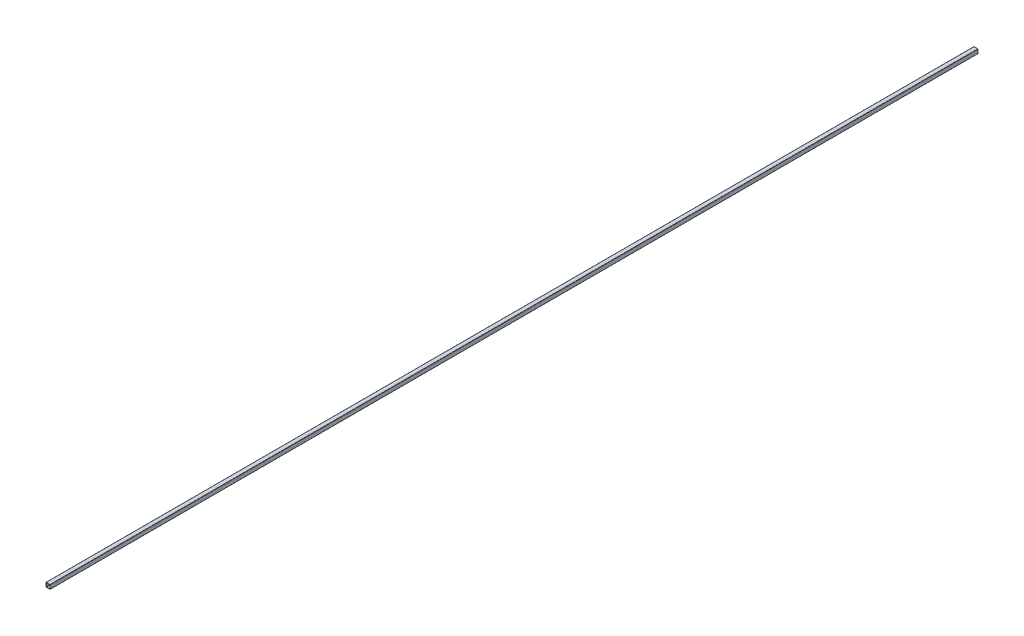
ISO-10303-21;
HEADER;
FILE_DESCRIPTION(('STEP AP214'),'2;1');
FILE_NAME('part.step','',(''),(''),'','','');
FILE_SCHEMA(('AUTOMOTIVE_DESIGN { 1 0 10303 214 1 1 1 1 }'));
ENDSEC;
DATA;
#1=APPLICATION_CONTEXT('core data for automotive mechanical design processes');
#2=APPLICATION_PROTOCOL_DEFINITION('international standard','automotive_design',2000,#1);
#3=PRODUCT_CONTEXT('',#1,'mechanical');
#4=PRODUCT('Part','Part','',(#3));
#5=PRODUCT_RELATED_PRODUCT_CATEGORY('part','',(#4));
#6=PRODUCT_DEFINITION_FORMATION('','',#4);
#7=PRODUCT_DEFINITION_CONTEXT('part definition',#1,'design');
#8=PRODUCT_DEFINITION('design','',#6,#7);
#9=PRODUCT_DEFINITION_SHAPE('','',#8);
#10=(LENGTH_UNIT() NAMED_UNIT(*) SI_UNIT(.MILLI.,.METRE.));
#11=(NAMED_UNIT(*) PLANE_ANGLE_UNIT() SI_UNIT($,.RADIAN.));
#12=(NAMED_UNIT(*) SI_UNIT($,.STERADIAN.) SOLID_ANGLE_UNIT());
#13=UNCERTAINTY_MEASURE_WITH_UNIT(LENGTH_MEASURE(1.E-05),#10,'distance_accuracy_value','');
#14=(GEOMETRIC_REPRESENTATION_CONTEXT(3) GLOBAL_UNCERTAINTY_ASSIGNED_CONTEXT((#13)) GLOBAL_UNIT_ASSIGNED_CONTEXT((#10,
#11,#12)) REPRESENTATION_CONTEXT('',''));
#15=CARTESIAN_POINT('',(0.,0.,0.));
#16=DIRECTION('',(0.,0.,1.));
#17=DIRECTION('',(1.,0.,0.));
#18=AXIS2_PLACEMENT_3D('',#15,#16,#17);
#19=CARTESIAN_POINT('',(2.54,-35.56,8380.));
#20=DIRECTION('',(0.,0.,1.));
#21=DIRECTION('',(1.,0.,0.));
#22=AXIS2_PLACEMENT_3D('',#19,#20,#21);
#23=PLANE('',#22);
#24=CARTESIAN_POINT('',(2.54,-35.56,8380.));
#25=DIRECTION('',(0.,0.,1.));
#26=DIRECTION('',(1.,0.,0.));
#27=AXIS2_PLACEMENT_3D('',#24,#25,#26);
#28=CIRCLE('',#27,2.54);
#29=CARTESIAN_POINT('',(0.,-35.56,8380.));
#30=VERTEX_POINT('',#29);
#31=CARTESIAN_POINT('',(2.54000000000002,-38.1,8380.));
#32=VERTEX_POINT('',#31);
#33=EDGE_CURVE('E211',#30,#32,#28,.T.);
#34=ORIENTED_EDGE('',*,*,#33,.T.);
#35=DIRECTION('',(1.,0.,0.));
#36=VECTOR('',#35,1.);
#37=CARTESIAN_POINT('',(2.54000000000002,-38.1,8380.));
#38=LINE('',#37,#36);
#39=CARTESIAN_POINT('',(35.56,-38.1,8380.));
#40=VERTEX_POINT('',#39);
#41=EDGE_CURVE('E214',#32,#40,#38,.T.);
#42=ORIENTED_EDGE('',*,*,#41,.T.);
#43=CARTESIAN_POINT('',(35.56,-35.56,8380.));
#44=DIRECTION('',(0.,0.,1.));
#45=DIRECTION('',(-1.,0.,0.));
#46=AXIS2_PLACEMENT_3D('',#43,#44,#45);
#47=CIRCLE('',#46,2.54);
#48=CARTESIAN_POINT('',(38.1,-35.56,8380.));
#49=VERTEX_POINT('',#48);
#50=EDGE_CURVE('E217',#40,#49,#47,.T.);
#51=ORIENTED_EDGE('',*,*,#50,.T.);
#52=DIRECTION('',(0.,1.,0.));
#53=VECTOR('',#52,1.);
#54=CARTESIAN_POINT('',(38.1,-2.54000000000002,8380.));
#55=LINE('',#54,#53);
#56=CARTESIAN_POINT('',(38.1,-2.54000000000002,8380.));
#57=VERTEX_POINT('',#56);
#58=EDGE_CURVE('E219',#49,#57,#55,.T.);
#59=ORIENTED_EDGE('',*,*,#58,.T.);
#60=CARTESIAN_POINT('',(35.56,-2.54,8380.));
#61=DIRECTION('',(0.,0.,1.));
#62=DIRECTION('',(1.,0.,0.));
#63=AXIS2_PLACEMENT_3D('',#60,#61,#62);
#64=CIRCLE('',#63,2.54);
#65=CARTESIAN_POINT('',(35.56,0.,8380.));
#66=VERTEX_POINT('',#65);
#67=EDGE_CURVE('E221',#57,#66,#64,.T.);
#68=ORIENTED_EDGE('',*,*,#67,.T.);
#69=DIRECTION('',(-1.,0.,0.));
#70=VECTOR('',#69,1.);
#71=CARTESIAN_POINT('',(2.54000000000002,0.,8380.));
#72=LINE('',#71,#70);
#73=CARTESIAN_POINT('',(2.54000000000002,0.,8380.));
#74=VERTEX_POINT('',#73);
#75=EDGE_CURVE('E223',#66,#74,#72,.T.);
#76=ORIENTED_EDGE('',*,*,#75,.T.);
#77=CARTESIAN_POINT('',(2.54,-2.54,8380.));
#78=DIRECTION('',(0.,0.,1.));
#79=DIRECTION('',(-1.,0.,0.));
#80=AXIS2_PLACEMENT_3D('',#77,#78,#79);
#81=CIRCLE('',#80,2.54);
#82=CARTESIAN_POINT('',(0.,-2.54000000000002,8380.));
#83=VERTEX_POINT('',#82);
#84=EDGE_CURVE('E225',#74,#83,#81,.T.);
#85=ORIENTED_EDGE('',*,*,#84,.T.);
#86=DIRECTION('',(0.,-1.,0.));
#87=VECTOR('',#86,1.);
#88=CARTESIAN_POINT('',(0.,-2.54000000000002,8380.));
#89=LINE('',#88,#87);
#90=EDGE_CURVE('E227',#83,#30,#89,.T.);
#91=ORIENTED_EDGE('',*,*,#90,.T.);
#92=EDGE_LOOP('',(#34,#42,#51,#59,#68,#76,#85,#91));
#93=FACE_BOUND('',#92,.T.);
#94=DIRECTION('',(1.,0.,0.));
#95=VECTOR('',#94,1.);
#96=CARTESIAN_POINT('',(5.30860000000002,-35.3314,8380.));
#97=LINE('',#96,#95);
#98=CARTESIAN_POINT('',(5.30860000000002,-35.3314,8380.));
#99=VERTEX_POINT('',#98);
#100=CARTESIAN_POINT('',(32.7914,-35.3314,8380.));
#101=VERTEX_POINT('',#100);
#102=EDGE_CURVE('E154',#99,#101,#97,.T.);
#103=ORIENTED_EDGE('',*,*,#102,.F.);
#104=CARTESIAN_POINT('',(5.3086,-32.7914,8380.));
#105=DIRECTION('',(0.,0.,1.));
#106=DIRECTION('',(1.,0.,0.));
#107=AXIS2_PLACEMENT_3D('',#104,#105,#106);
#108=CIRCLE('',#107,2.54);
#109=CARTESIAN_POINT('',(2.7686,-32.7914,8380.));
#110=VERTEX_POINT('',#109);
#111=EDGE_CURVE('E146',#110,#99,#108,.T.);
#112=ORIENTED_EDGE('',*,*,#111,.F.);
#113=DIRECTION('',(0.,-1.,0.));
#114=VECTOR('',#113,1.);
#115=CARTESIAN_POINT('',(2.7686,-5.30860000000002,8380.));
#116=LINE('',#115,#114);
#117=CARTESIAN_POINT('',(2.7686,-5.30860000000002,8380.));
#118=VERTEX_POINT('',#117);
#119=EDGE_CURVE('E179',#118,#110,#116,.T.);
#120=ORIENTED_EDGE('',*,*,#119,.F.);
#121=CARTESIAN_POINT('',(5.3086,-5.3086,8380.));
#122=DIRECTION('',(0.,0.,1.));
#123=DIRECTION('',(1.,0.,0.));
#124=AXIS2_PLACEMENT_3D('',#121,#122,#123);
#125=CIRCLE('',#124,2.54);
#126=CARTESIAN_POINT('',(5.30860000000002,-2.7686,8380.));
#127=VERTEX_POINT('',#126);
#128=EDGE_CURVE('E177',#127,#118,#125,.T.);
#129=ORIENTED_EDGE('',*,*,#128,.F.);
#130=DIRECTION('',(-1.,0.,0.));
#131=VECTOR('',#130,1.);
#132=CARTESIAN_POINT('',(5.30860000000002,-2.7686,8380.));
#133=LINE('',#132,#131);
#134=CARTESIAN_POINT('',(32.7914,-2.7686,8380.));
#135=VERTEX_POINT('',#134);
#136=EDGE_CURVE('E175',#135,#127,#133,.T.);
#137=ORIENTED_EDGE('',*,*,#136,.F.);
#138=CARTESIAN_POINT('',(32.7914,-5.3086,8380.));
#139=DIRECTION('',(0.,0.,1.));
#140=DIRECTION('',(1.,0.,0.));
#141=AXIS2_PLACEMENT_3D('',#138,#139,#140);
#142=CIRCLE('',#141,2.54);
#143=CARTESIAN_POINT('',(35.3314,-5.30860000000002,8380.));
#144=VERTEX_POINT('',#143);
#145=EDGE_CURVE('E173',#144,#135,#142,.T.);
#146=ORIENTED_EDGE('',*,*,#145,.F.);
#147=DIRECTION('',(0.,1.,0.));
#148=VECTOR('',#147,1.);
#149=CARTESIAN_POINT('',(35.3314,-5.30860000000002,8380.));
#150=LINE('',#149,#148);
#151=CARTESIAN_POINT('',(35.3314,-32.7914,8380.));
#152=VERTEX_POINT('',#151);
#153=EDGE_CURVE('E169',#152,#144,#150,.T.);
#154=ORIENTED_EDGE('',*,*,#153,.F.);
#155=CARTESIAN_POINT('',(32.7914,-32.7914,8380.));
#156=DIRECTION('',(0.,0.,1.));
#157=DIRECTION('',(1.,0.,0.));
#158=AXIS2_PLACEMENT_3D('',#155,#156,#157);
#159=CIRCLE('',#158,2.54);
#160=EDGE_CURVE('E167',#101,#152,#159,.T.);
#161=ORIENTED_EDGE('',*,*,#160,.F.);
#162=EDGE_LOOP('',(#103,#112,#120,#129,#137,#146,#154,#161));
#163=FACE_BOUND('',#162,.T.);
#164=ADVANCED_FACE('F33',(#93,#163),#23,.T.);
#165=CARTESIAN_POINT('',(2.54,-35.56,0.));
#166=DIRECTION('',(0.,0.,1.));
#167=DIRECTION('',(1.,0.,0.));
#168=AXIS2_PLACEMENT_3D('',#165,#166,#167);
#169=PLANE('',#168);
#170=CARTESIAN_POINT('',(2.54,-35.56,0.));
#171=DIRECTION('',(0.,0.,1.));
#172=DIRECTION('',(1.,0.,0.));
#173=AXIS2_PLACEMENT_3D('',#170,#171,#172);
#174=CIRCLE('',#173,2.54);
#175=CARTESIAN_POINT('',(0.,-35.56,0.));
#176=VERTEX_POINT('',#175);
#177=CARTESIAN_POINT('',(2.54000000000002,-38.1,0.));
#178=VERTEX_POINT('',#177);
#179=EDGE_CURVE('E162',#176,#178,#174,.T.);
#180=ORIENTED_EDGE('',*,*,#179,.F.);
#181=DIRECTION('',(0.,-1.,0.));
#182=VECTOR('',#181,1.);
#183=CARTESIAN_POINT('',(0.,-2.54000000000002,0.));
#184=LINE('',#183,#182);
#185=CARTESIAN_POINT('',(0.,-2.54000000000002,0.));
#186=VERTEX_POINT('',#185);
#187=EDGE_CURVE('E215',#186,#176,#184,.T.);
#188=ORIENTED_EDGE('',*,*,#187,.F.);
#189=CARTESIAN_POINT('',(2.54,-2.54,0.));
#190=DIRECTION('',(0.,0.,1.));
#191=DIRECTION('',(-1.,0.,0.));
#192=AXIS2_PLACEMENT_3D('',#189,#190,#191);
#193=CIRCLE('',#192,2.54);
#194=CARTESIAN_POINT('',(2.54000000000002,0.,0.));
#195=VERTEX_POINT('',#194);
#196=EDGE_CURVE('E242',#195,#186,#193,.T.);
#197=ORIENTED_EDGE('',*,*,#196,.F.);
#198=DIRECTION('',(-1.,0.,0.));
#199=VECTOR('',#198,1.);
#200=CARTESIAN_POINT('',(2.54000000000002,0.,0.));
#201=LINE('',#200,#199);
#202=CARTESIAN_POINT('',(35.56,0.,0.));
#203=VERTEX_POINT('',#202);
#204=EDGE_CURVE('E240',#203,#195,#201,.T.);
#205=ORIENTED_EDGE('',*,*,#204,.F.);
#206=CARTESIAN_POINT('',(35.56,-2.54,0.));
#207=DIRECTION('',(0.,0.,1.));
#208=DIRECTION('',(1.,0.,0.));
#209=AXIS2_PLACEMENT_3D('',#206,#207,#208);
#210=CIRCLE('',#209,2.54);
#211=CARTESIAN_POINT('',(38.1,-2.54000000000002,0.));
#212=VERTEX_POINT('',#211);
#213=EDGE_CURVE('E238',#212,#203,#210,.T.);
#214=ORIENTED_EDGE('',*,*,#213,.F.);
#215=DIRECTION('',(0.,1.,0.));
#216=VECTOR('',#215,1.);
#217=CARTESIAN_POINT('',(38.1,-2.54000000000002,0.));
#218=LINE('',#217,#216);
#219=CARTESIAN_POINT('',(38.1,-35.56,0.));
#220=VERTEX_POINT('',#219);
#221=EDGE_CURVE('E236',#220,#212,#218,.T.);
#222=ORIENTED_EDGE('',*,*,#221,.F.);
#223=CARTESIAN_POINT('',(35.56,-35.56,0.));
#224=DIRECTION('',(0.,0.,1.));
#225=DIRECTION('',(-1.,0.,0.));
#226=AXIS2_PLACEMENT_3D('',#223,#224,#225);
#227=CIRCLE('',#226,2.54);
#228=CARTESIAN_POINT('',(35.56,-38.1,0.));
#229=VERTEX_POINT('',#228);
#230=EDGE_CURVE('E234',#229,#220,#227,.T.);
#231=ORIENTED_EDGE('',*,*,#230,.F.);
#232=DIRECTION('',(1.,0.,0.));
#233=VECTOR('',#232,1.);
#234=CARTESIAN_POINT('',(2.54000000000002,-38.1,0.));
#235=LINE('',#234,#233);
#236=EDGE_CURVE('E232',#178,#229,#235,.T.);
#237=ORIENTED_EDGE('',*,*,#236,.F.);
#238=EDGE_LOOP('',(#180,#188,#197,#205,#214,#222,#231,#237));
#239=FACE_BOUND('',#238,.T.);
#240=CARTESIAN_POINT('',(5.3086,-32.7914,0.));
#241=DIRECTION('',(0.,0.,1.));
#242=DIRECTION('',(1.,0.,0.));
#243=AXIS2_PLACEMENT_3D('',#240,#241,#242);
#244=CIRCLE('',#243,2.54);
#245=CARTESIAN_POINT('',(2.7686,-32.7914,0.));
#246=VERTEX_POINT('',#245);
#247=CARTESIAN_POINT('',(5.30860000000002,-35.3314,0.));
#248=VERTEX_POINT('',#247);
#249=EDGE_CURVE('E56',#246,#248,#244,.T.);
#250=ORIENTED_EDGE('',*,*,#249,.T.);
#251=DIRECTION('',(1.,0.,0.));
#252=VECTOR('',#251,1.);
#253=CARTESIAN_POINT('',(5.30860000000002,-35.3314,0.));
#254=LINE('',#253,#252);
#255=CARTESIAN_POINT('',(32.7914,-35.3314,0.));
#256=VERTEX_POINT('',#255);
#257=EDGE_CURVE('E161',#248,#256,#254,.T.);
#258=ORIENTED_EDGE('',*,*,#257,.T.);
#259=CARTESIAN_POINT('',(32.7914,-32.7914,0.));
#260=DIRECTION('',(0.,0.,1.));
#261=DIRECTION('',(1.,0.,0.));
#262=AXIS2_PLACEMENT_3D('',#259,#260,#261);
#263=CIRCLE('',#262,2.54);
#264=CARTESIAN_POINT('',(35.3314,-32.7914,0.));
#265=VERTEX_POINT('',#264);
#266=EDGE_CURVE('E183',#256,#265,#263,.T.);
#267=ORIENTED_EDGE('',*,*,#266,.T.);
#268=DIRECTION('',(0.,1.,0.));
#269=VECTOR('',#268,1.);
#270=CARTESIAN_POINT('',(35.3314,-5.30860000000002,0.));
#271=LINE('',#270,#269);
#272=CARTESIAN_POINT('',(35.3314,-5.30860000000002,0.));
#273=VERTEX_POINT('',#272);
#274=EDGE_CURVE('E186',#265,#273,#271,.T.);
#275=ORIENTED_EDGE('',*,*,#274,.T.);
#276=CARTESIAN_POINT('',(32.7914,-5.3086,0.));
#277=DIRECTION('',(0.,0.,1.));
#278=DIRECTION('',(1.,0.,0.));
#279=AXIS2_PLACEMENT_3D('',#276,#277,#278);
#280=CIRCLE('',#279,2.54);
#281=CARTESIAN_POINT('',(32.7914,-2.7686,0.));
#282=VERTEX_POINT('',#281);
#283=EDGE_CURVE('E189',#273,#282,#280,.T.);
#284=ORIENTED_EDGE('',*,*,#283,.T.);
#285=DIRECTION('',(-1.,0.,0.));
#286=VECTOR('',#285,1.);
#287=CARTESIAN_POINT('',(5.30860000000002,-2.7686,0.));
#288=LINE('',#287,#286);
#289=CARTESIAN_POINT('',(5.30860000000002,-2.7686,0.));
#290=VERTEX_POINT('',#289);
#291=EDGE_CURVE('E192',#282,#290,#288,.T.);
#292=ORIENTED_EDGE('',*,*,#291,.T.);
#293=CARTESIAN_POINT('',(5.3086,-5.3086,0.));
#294=DIRECTION('',(0.,0.,1.));
#295=DIRECTION('',(1.,0.,0.));
#296=AXIS2_PLACEMENT_3D('',#293,#294,#295);
#297=CIRCLE('',#296,2.54);
#298=CARTESIAN_POINT('',(2.7686,-5.30860000000002,0.));
#299=VERTEX_POINT('',#298);
#300=EDGE_CURVE('E195',#290,#299,#297,.T.);
#301=ORIENTED_EDGE('',*,*,#300,.T.);
#302=DIRECTION('',(0.,-1.,0.));
#303=VECTOR('',#302,1.);
#304=CARTESIAN_POINT('',(2.7686,-5.30860000000002,0.));
#305=LINE('',#304,#303);
#306=EDGE_CURVE('E155',#299,#246,#305,.T.);
#307=ORIENTED_EDGE('',*,*,#306,.T.);
#308=EDGE_LOOP('',(#250,#258,#267,#275,#284,#292,#301,#307));
#309=FACE_BOUND('',#308,.T.);
#310=ADVANCED_FACE('F272',(#239,#309),#169,.F.);
#311=CARTESIAN_POINT('',(2.54,-35.56,8380.));
#312=DIRECTION('',(0.,0.,-1.));
#313=DIRECTION('',(-1.,0.,0.));
#314=AXIS2_PLACEMENT_3D('',#311,#312,#313);
#315=CYLINDRICAL_SURFACE('',#314,2.54);
#316=ORIENTED_EDGE('',*,*,#179,.T.);
#317=DIRECTION('',(0.,0.,-1.));
#318=VECTOR('',#317,1.);
#319=CARTESIAN_POINT('',(2.54000000000002,-38.1,8380.));
#320=LINE('',#319,#318);
#321=EDGE_CURVE('E11',#32,#178,#320,.T.);
#322=ORIENTED_EDGE('',*,*,#321,.F.);
#323=ORIENTED_EDGE('',*,*,#33,.F.);
#324=DIRECTION('',(0.,0.,-1.));
#325=VECTOR('',#324,1.);
#326=CARTESIAN_POINT('',(0.,-35.56,8380.));
#327=LINE('',#326,#325);
#328=EDGE_CURVE('E229',#30,#176,#327,.T.);
#329=ORIENTED_EDGE('',*,*,#328,.T.);
#330=EDGE_LOOP('',(#316,#322,#323,#329));
#331=FACE_BOUND('',#330,.T.);
#332=ADVANCED_FACE('F35',(#331),#315,.T.);
#333=CARTESIAN_POINT('',(2.54000000000002,-38.1,8380.));
#334=DIRECTION('',(0.,1.,0.));
#335=DIRECTION('',(0.,0.,1.));
#336=AXIS2_PLACEMENT_3D('',#333,#334,#335);
#337=PLANE('',#336);
#338=ORIENTED_EDGE('',*,*,#236,.T.);
#339=DIRECTION('',(0.,0.,-1.));
#340=VECTOR('',#339,1.);
#341=CARTESIAN_POINT('',(35.56,-38.1,8380.));
#342=LINE('',#341,#340);
#343=EDGE_CURVE('E41',#40,#229,#342,.T.);
#344=ORIENTED_EDGE('',*,*,#343,.F.);
#345=ORIENTED_EDGE('',*,*,#41,.F.);
#346=ORIENTED_EDGE('',*,*,#321,.T.);
#347=EDGE_LOOP('',(#338,#344,#345,#346));
#348=FACE_BOUND('',#347,.T.);
#349=ADVANCED_FACE('F289',(#348),#337,.F.);
#350=CARTESIAN_POINT('',(35.56,-35.56,8380.));
#351=DIRECTION('',(0.,0.,-1.));
#352=DIRECTION('',(-1.,0.,0.));
#353=AXIS2_PLACEMENT_3D('',#350,#351,#352);
#354=CYLINDRICAL_SURFACE('',#353,2.54);
#355=ORIENTED_EDGE('',*,*,#230,.T.);
#356=DIRECTION('',(0.,0.,-1.));
#357=VECTOR('',#356,1.);
#358=CARTESIAN_POINT('',(38.1,-35.56,8380.));
#359=LINE('',#358,#357);
#360=EDGE_CURVE('E259',#49,#220,#359,.T.);
#361=ORIENTED_EDGE('',*,*,#360,.F.);
#362=ORIENTED_EDGE('',*,*,#50,.F.);
#363=ORIENTED_EDGE('',*,*,#343,.T.);
#364=EDGE_LOOP('',(#355,#361,#362,#363));
#365=FACE_BOUND('',#364,.T.);
#366=ADVANCED_FACE('F266',(#365),#354,.T.);
#367=CARTESIAN_POINT('',(38.1,-2.54000000000002,8380.));
#368=DIRECTION('',(-1.,0.,0.));
#369=DIRECTION('',(0.,-1.,0.));
#370=AXIS2_PLACEMENT_3D('',#367,#368,#369);
#371=PLANE('',#370);
#372=ORIENTED_EDGE('',*,*,#221,.T.);
#373=DIRECTION('',(0.,0.,-1.));
#374=VECTOR('',#373,1.);
#375=CARTESIAN_POINT('',(38.1,-2.54000000000002,8380.));
#376=LINE('',#375,#374);
#377=EDGE_CURVE('E256',#57,#212,#376,.T.);
#378=ORIENTED_EDGE('',*,*,#377,.F.);
#379=ORIENTED_EDGE('',*,*,#58,.F.);
#380=ORIENTED_EDGE('',*,*,#360,.T.);
#381=EDGE_LOOP('',(#372,#378,#379,#380));
#382=FACE_BOUND('',#381,.T.);
#383=ADVANCED_FACE('F278',(#382),#371,.F.);
#384=CARTESIAN_POINT('',(35.56,-2.54,8380.));
#385=DIRECTION('',(0.,0.,-1.));
#386=DIRECTION('',(-1.,0.,0.));
#387=AXIS2_PLACEMENT_3D('',#384,#385,#386);
#388=CYLINDRICAL_SURFACE('',#387,2.54);
#389=ORIENTED_EDGE('',*,*,#213,.T.);
#390=DIRECTION('',(0.,0.,-1.));
#391=VECTOR('',#390,1.);
#392=CARTESIAN_POINT('',(35.56,0.,8380.));
#393=LINE('',#392,#391);
#394=EDGE_CURVE('E253',#66,#203,#393,.T.);
#395=ORIENTED_EDGE('',*,*,#394,.F.);
#396=ORIENTED_EDGE('',*,*,#67,.F.);
#397=ORIENTED_EDGE('',*,*,#377,.T.);
#398=EDGE_LOOP('',(#389,#395,#396,#397));
#399=FACE_BOUND('',#398,.T.);
#400=ADVANCED_FACE('F282',(#399),#388,.T.);
#401=CARTESIAN_POINT('',(2.54000000000002,0.,8380.));
#402=DIRECTION('',(0.,-1.,0.));
#403=DIRECTION('',(0.,0.,-1.));
#404=AXIS2_PLACEMENT_3D('',#401,#402,#403);
#405=PLANE('',#404);
#406=ORIENTED_EDGE('',*,*,#204,.T.);
#407=DIRECTION('',(0.,0.,-1.));
#408=VECTOR('',#407,1.);
#409=CARTESIAN_POINT('',(2.54000000000002,0.,8380.));
#410=LINE('',#409,#408);
#411=EDGE_CURVE('E250',#74,#195,#410,.T.);
#412=ORIENTED_EDGE('',*,*,#411,.F.);
#413=ORIENTED_EDGE('',*,*,#75,.F.);
#414=ORIENTED_EDGE('',*,*,#394,.T.);
#415=EDGE_LOOP('',(#406,#412,#413,#414));
#416=FACE_BOUND('',#415,.T.);
#417=ADVANCED_FACE('F302',(#416),#405,.F.);
#418=CARTESIAN_POINT('',(2.54,-2.54,8380.));
#419=DIRECTION('',(0.,0.,-1.));
#420=DIRECTION('',(-1.,0.,0.));
#421=AXIS2_PLACEMENT_3D('',#418,#419,#420);
#422=CYLINDRICAL_SURFACE('',#421,2.54);
#423=ORIENTED_EDGE('',*,*,#196,.T.);
#424=DIRECTION('',(0.,0.,-1.));
#425=VECTOR('',#424,1.);
#426=CARTESIAN_POINT('',(0.,-2.54000000000002,8380.));
#427=LINE('',#426,#425);
#428=EDGE_CURVE('E247',#83,#186,#427,.T.);
#429=ORIENTED_EDGE('',*,*,#428,.F.);
#430=ORIENTED_EDGE('',*,*,#84,.F.);
#431=ORIENTED_EDGE('',*,*,#411,.T.);
#432=EDGE_LOOP('',(#423,#429,#430,#431));
#433=FACE_BOUND('',#432,.T.);
#434=ADVANCED_FACE('F300',(#433),#422,.T.);
#435=CARTESIAN_POINT('',(0.,-2.54000000000002,8380.));
#436=DIRECTION('',(1.,0.,0.));
#437=DIRECTION('',(0.,1.,0.));
#438=AXIS2_PLACEMENT_3D('',#435,#436,#437);
#439=PLANE('',#438);
#440=ORIENTED_EDGE('',*,*,#187,.T.);
#441=ORIENTED_EDGE('',*,*,#328,.F.);
#442=ORIENTED_EDGE('',*,*,#90,.F.);
#443=ORIENTED_EDGE('',*,*,#428,.T.);
#444=EDGE_LOOP('',(#440,#441,#442,#443));
#445=FACE_BOUND('',#444,.T.);
#446=ADVANCED_FACE('F295',(#445),#439,.F.);
#447=CARTESIAN_POINT('',(5.3086,-32.7914,8380.));
#448=DIRECTION('',(0.,0.,-1.));
#449=DIRECTION('',(-1.,0.,0.));
#450=AXIS2_PLACEMENT_3D('',#447,#448,#449);
#451=CYLINDRICAL_SURFACE('',#450,2.54);
#452=ORIENTED_EDGE('',*,*,#249,.F.);
#453=DIRECTION('',(0.,0.,-1.));
#454=VECTOR('',#453,1.);
#455=CARTESIAN_POINT('',(2.7686,-32.7914,8380.));
#456=LINE('',#455,#454);
#457=EDGE_CURVE('E150',#110,#246,#456,.T.);
#458=ORIENTED_EDGE('',*,*,#457,.F.);
#459=ORIENTED_EDGE('',*,*,#111,.T.);
#460=DIRECTION('',(0.,0.,-1.));
#461=VECTOR('',#460,1.);
#462=CARTESIAN_POINT('',(5.30860000000002,-35.3314,8380.));
#463=LINE('',#462,#461);
#464=EDGE_CURVE('E149',#99,#248,#463,.T.);
#465=ORIENTED_EDGE('',*,*,#464,.T.);
#466=EDGE_LOOP('',(#452,#458,#459,#465));
#467=FACE_BOUND('',#466,.T.);
#468=ADVANCED_FACE('F148',(#467),#451,.F.);
#469=CARTESIAN_POINT('',(5.30860000000002,-35.3314,8380.));
#470=DIRECTION('',(0.,1.,0.));
#471=DIRECTION('',(0.,0.,1.));
#472=AXIS2_PLACEMENT_3D('',#469,#470,#471);
#473=PLANE('',#472);
#474=ORIENTED_EDGE('',*,*,#257,.F.);
#475=ORIENTED_EDGE('',*,*,#464,.F.);
#476=ORIENTED_EDGE('',*,*,#102,.T.);
#477=DIRECTION('',(0.,0.,-1.));
#478=VECTOR('',#477,1.);
#479=CARTESIAN_POINT('',(32.7914,-35.3314,8380.));
#480=LINE('',#479,#478);
#481=EDGE_CURVE('E163',#101,#256,#480,.T.);
#482=ORIENTED_EDGE('',*,*,#481,.T.);
#483=EDGE_LOOP('',(#474,#475,#476,#482));
#484=FACE_BOUND('',#483,.T.);
#485=ADVANCED_FACE('F158',(#484),#473,.T.);
#486=CARTESIAN_POINT('',(32.7914,-32.7914,8380.));
#487=DIRECTION('',(0.,0.,-1.));
#488=DIRECTION('',(-1.,0.,0.));
#489=AXIS2_PLACEMENT_3D('',#486,#487,#488);
#490=CYLINDRICAL_SURFACE('',#489,2.54);
#491=ORIENTED_EDGE('',*,*,#266,.F.);
#492=ORIENTED_EDGE('',*,*,#481,.F.);
#493=ORIENTED_EDGE('',*,*,#160,.T.);
#494=DIRECTION('',(0.,0.,-1.));
#495=VECTOR('',#494,1.);
#496=CARTESIAN_POINT('',(35.3314,-32.7914,8380.));
#497=LINE('',#496,#495);
#498=EDGE_CURVE('E208',#152,#265,#497,.T.);
#499=ORIENTED_EDGE('',*,*,#498,.T.);
#500=EDGE_LOOP('',(#491,#492,#493,#499));
#501=FACE_BOUND('',#500,.T.);
#502=ADVANCED_FACE('F327',(#501),#490,.F.);
#503=CARTESIAN_POINT('',(35.3314,-5.30860000000002,8380.));
#504=DIRECTION('',(-1.,0.,0.));
#505=DIRECTION('',(0.,0.,1.));
#506=AXIS2_PLACEMENT_3D('',#503,#504,#505);
#507=PLANE('',#506);
#508=ORIENTED_EDGE('',*,*,#274,.F.);
#509=ORIENTED_EDGE('',*,*,#498,.F.);
#510=ORIENTED_EDGE('',*,*,#153,.T.);
#511=DIRECTION('',(0.,0.,-1.));
#512=VECTOR('',#511,1.);
#513=CARTESIAN_POINT('',(35.3314,-5.30860000000002,8380.));
#514=LINE('',#513,#512);
#515=EDGE_CURVE('E206',#144,#273,#514,.T.);
#516=ORIENTED_EDGE('',*,*,#515,.T.);
#517=EDGE_LOOP('',(#508,#509,#510,#516));
#518=FACE_BOUND('',#517,.T.);
#519=ADVANCED_FACE('F331',(#518),#507,.T.);
#520=CARTESIAN_POINT('',(32.7914,-5.3086,8380.));
#521=DIRECTION('',(0.,0.,-1.));
#522=DIRECTION('',(-1.,0.,0.));
#523=AXIS2_PLACEMENT_3D('',#520,#521,#522);
#524=CYLINDRICAL_SURFACE('',#523,2.54);
#525=ORIENTED_EDGE('',*,*,#283,.F.);
#526=ORIENTED_EDGE('',*,*,#515,.F.);
#527=ORIENTED_EDGE('',*,*,#145,.T.);
#528=DIRECTION('',(0.,0.,-1.));
#529=VECTOR('',#528,1.);
#530=CARTESIAN_POINT('',(32.7914,-2.7686,8380.));
#531=LINE('',#530,#529);
#532=EDGE_CURVE('E204',#135,#282,#531,.T.);
#533=ORIENTED_EDGE('',*,*,#532,.T.);
#534=EDGE_LOOP('',(#525,#526,#527,#533));
#535=FACE_BOUND('',#534,.T.);
#536=ADVANCED_FACE('F337',(#535),#524,.F.);
#537=CARTESIAN_POINT('',(5.30860000000002,-2.7686,8380.));
#538=DIRECTION('',(0.,-1.,0.));
#539=DIRECTION('',(0.,0.,-1.));
#540=AXIS2_PLACEMENT_3D('',#537,#538,#539);
#541=PLANE('',#540);
#542=ORIENTED_EDGE('',*,*,#291,.F.);
#543=ORIENTED_EDGE('',*,*,#532,.F.);
#544=ORIENTED_EDGE('',*,*,#136,.T.);
#545=DIRECTION('',(0.,0.,-1.));
#546=VECTOR('',#545,1.);
#547=CARTESIAN_POINT('',(5.30860000000002,-2.7686,8380.));
#548=LINE('',#547,#546);
#549=EDGE_CURVE('E202',#127,#290,#548,.T.);
#550=ORIENTED_EDGE('',*,*,#549,.T.);
#551=EDGE_LOOP('',(#542,#543,#544,#550));
#552=FACE_BOUND('',#551,.T.);
#553=ADVANCED_FACE('F341',(#552),#541,.T.);
#554=CARTESIAN_POINT('',(5.3086,-5.3086,8380.));
#555=DIRECTION('',(0.,0.,-1.));
#556=DIRECTION('',(-1.,0.,0.));
#557=AXIS2_PLACEMENT_3D('',#554,#555,#556);
#558=CYLINDRICAL_SURFACE('',#557,2.54);
#559=ORIENTED_EDGE('',*,*,#300,.F.);
#560=ORIENTED_EDGE('',*,*,#549,.F.);
#561=ORIENTED_EDGE('',*,*,#128,.T.);
#562=DIRECTION('',(0.,0.,-1.));
#563=VECTOR('',#562,1.);
#564=CARTESIAN_POINT('',(2.7686,-5.30860000000002,8380.));
#565=LINE('',#564,#563);
#566=EDGE_CURVE('E48',#118,#299,#565,.T.);
#567=ORIENTED_EDGE('',*,*,#566,.T.);
#568=EDGE_LOOP('',(#559,#560,#561,#567));
#569=FACE_BOUND('',#568,.T.);
#570=ADVANCED_FACE('F345',(#569),#558,.F.);
#571=CARTESIAN_POINT('',(2.7686,-5.30860000000002,8380.));
#572=DIRECTION('',(1.,0.,0.));
#573=DIRECTION('',(0.,0.,-1.));
#574=AXIS2_PLACEMENT_3D('',#571,#572,#573);
#575=PLANE('',#574);
#576=ORIENTED_EDGE('',*,*,#306,.F.);
#577=ORIENTED_EDGE('',*,*,#566,.F.);
#578=ORIENTED_EDGE('',*,*,#119,.T.);
#579=ORIENTED_EDGE('',*,*,#457,.T.);
#580=EDGE_LOOP('',(#576,#577,#578,#579));
#581=FACE_BOUND('',#580,.T.);
#582=ADVANCED_FACE('F349',(#581),#575,.T.);
#583=CLOSED_SHELL('',(#164,#310,#332,#349,#366,#383,#400,#417,#434,#446,#468,#485,#502,#519,
#536,#553,#570,#582));
#584=MANIFOLD_SOLID_BREP('B2',#583);
#585=ADVANCED_BREP_SHAPE_REPRESENTATION('',(#18,#584),#14);
#586=SHAPE_DEFINITION_REPRESENTATION(#9,#585);
ENDSEC;
END-ISO-10303-21;
